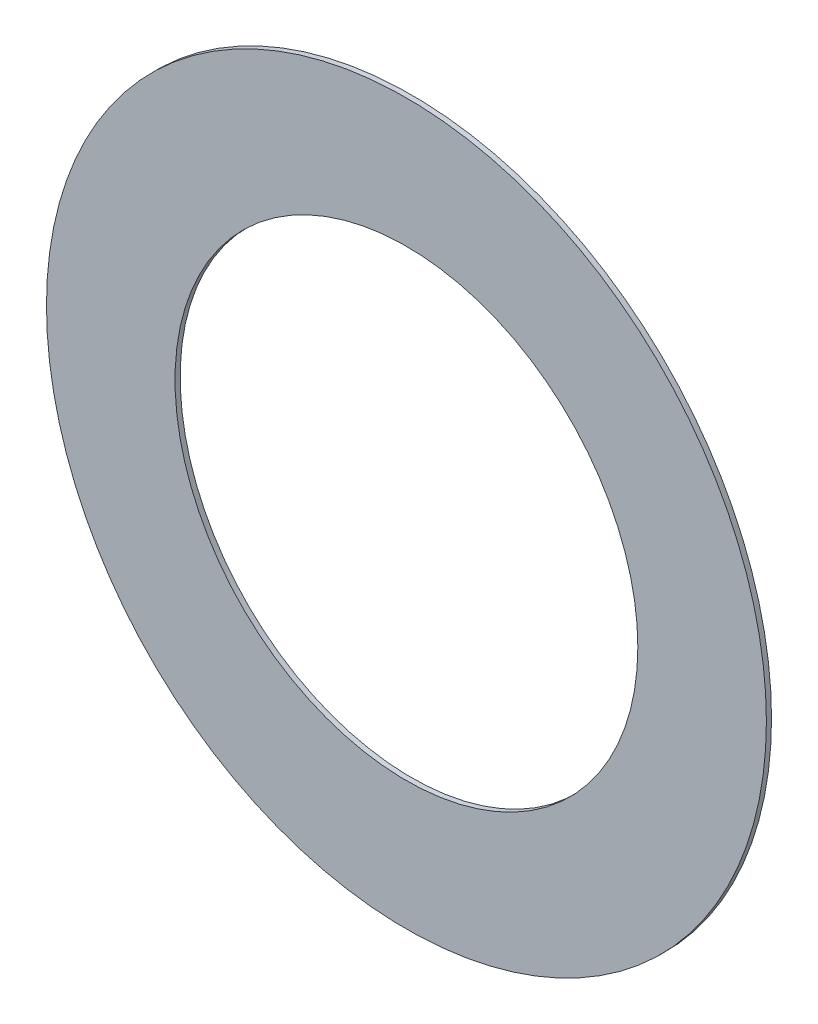
ISO-10303-21;
HEADER;
FILE_DESCRIPTION(('STEP AP214'),'2;1');
FILE_NAME('part.step','',(''),(''),'','','');
FILE_SCHEMA(('AUTOMOTIVE_DESIGN { 1 0 10303 214 1 1 1 1 }'));
ENDSEC;
DATA;
#1=APPLICATION_CONTEXT('core data for automotive mechanical design processes');
#2=APPLICATION_PROTOCOL_DEFINITION('international standard','automotive_design',2000,#1);
#3=PRODUCT_CONTEXT('',#1,'mechanical');
#4=PRODUCT('Part','Part','',(#3));
#5=PRODUCT_RELATED_PRODUCT_CATEGORY('part','',(#4));
#6=PRODUCT_DEFINITION_FORMATION('','',#4);
#7=PRODUCT_DEFINITION_CONTEXT('part definition',#1,'design');
#8=PRODUCT_DEFINITION('design','',#6,#7);
#9=PRODUCT_DEFINITION_SHAPE('','',#8);
#10=(LENGTH_UNIT() NAMED_UNIT(*) SI_UNIT(.MILLI.,.METRE.));
#11=(NAMED_UNIT(*) PLANE_ANGLE_UNIT() SI_UNIT($,.RADIAN.));
#12=(NAMED_UNIT(*) SI_UNIT($,.STERADIAN.) SOLID_ANGLE_UNIT());
#13=UNCERTAINTY_MEASURE_WITH_UNIT(LENGTH_MEASURE(1.E-05),#10,'distance_accuracy_value','');
#14=(GEOMETRIC_REPRESENTATION_CONTEXT(3) GLOBAL_UNCERTAINTY_ASSIGNED_CONTEXT((#13)) GLOBAL_UNIT_ASSIGNED_CONTEXT((#10,
#11,#12)) REPRESENTATION_CONTEXT('',''));
#15=CARTESIAN_POINT('',(0.,0.,0.));
#16=DIRECTION('',(0.,0.,1.));
#17=DIRECTION('',(1.,0.,0.));
#18=AXIS2_PLACEMENT_3D('',#15,#16,#17);
#19=CARTESIAN_POINT('',(0.,0.,0.01));
#20=DIRECTION('',(0.,0.,1.));
#21=DIRECTION('',(1.,0.,0.));
#22=AXIS2_PLACEMENT_3D('',#19,#20,#21);
#23=PLANE('',#22);
#24=CARTESIAN_POINT('',(-4.445,-8.965,0.01));
#25=DIRECTION('',(0.,0.,1.));
#26=DIRECTION('',(1.,0.,0.));
#27=AXIS2_PLACEMENT_3D('',#24,#25,#26);
#28=CIRCLE('',#27,0.45);
#29=CARTESIAN_POINT('',(-3.995,-8.965,0.01));
#30=VERTEX_POINT('',#29);
#31=EDGE_CURVE('E27',#30,#30,#28,.F.);
#32=ORIENTED_EDGE('',*,*,#31,.T.);
#33=EDGE_LOOP('',(#32));
#34=FACE_BOUND('',#33,.T.);
#35=CARTESIAN_POINT('',(-4.445,-8.965,0.01));
#36=DIRECTION('',(0.,0.,1.));
#37=DIRECTION('',(1.,0.,0.));
#38=AXIS2_PLACEMENT_3D('',#35,#36,#37);
#39=CIRCLE('',#38,0.7);
#40=CARTESIAN_POINT('',(-3.745,-8.965,0.01));
#41=VERTEX_POINT('',#40);
#42=EDGE_CURVE('E18',#41,#41,#39,.F.);
#43=ORIENTED_EDGE('',*,*,#42,.F.);
#44=EDGE_LOOP('',(#43));
#45=FACE_BOUND('',#44,.T.);
#46=ADVANCED_FACE('F15',(#34,#45),#23,.T.);
#47=CARTESIAN_POINT('',(-4.445,-8.965,0.));
#48=DIRECTION('',(0.,0.,1.));
#49=DIRECTION('',(1.,0.,0.));
#50=AXIS2_PLACEMENT_3D('',#47,#48,#49);
#51=CYLINDRICAL_SURFACE('',#50,0.7);
#52=ORIENTED_EDGE('',*,*,#42,.T.);
#53=EDGE_LOOP('',(#52));
#54=FACE_BOUND('',#53,.T.);
#55=CARTESIAN_POINT('',(-4.445,-8.965,0.));
#56=DIRECTION('',(0.,0.,1.));
#57=DIRECTION('',(1.,0.,0.));
#58=AXIS2_PLACEMENT_3D('',#55,#56,#57);
#59=CIRCLE('',#58,0.7);
#60=CARTESIAN_POINT('',(-3.745,-8.965,0.));
#61=VERTEX_POINT('',#60);
#62=EDGE_CURVE('E22',#61,#61,#59,.T.);
#63=ORIENTED_EDGE('',*,*,#62,.T.);
#64=EDGE_LOOP('',(#63));
#65=FACE_BOUND('',#64,.T.);
#66=ADVANCED_FACE('F35',(#54,#65),#51,.T.);
#67=CARTESIAN_POINT('',(-4.445,-8.965,0.));
#68=DIRECTION('',(0.,0.,1.));
#69=DIRECTION('',(1.,0.,0.));
#70=AXIS2_PLACEMENT_3D('',#67,#68,#69);
#71=CYLINDRICAL_SURFACE('',#70,0.45);
#72=ORIENTED_EDGE('',*,*,#31,.F.);
#73=EDGE_LOOP('',(#72));
#74=FACE_BOUND('',#73,.T.);
#75=CARTESIAN_POINT('',(-4.445,-8.965,0.));
#76=DIRECTION('',(0.,0.,1.));
#77=DIRECTION('',(1.,0.,0.));
#78=AXIS2_PLACEMENT_3D('',#75,#76,#77);
#79=CIRCLE('',#78,0.45);
#80=CARTESIAN_POINT('',(-3.995,-8.965,0.));
#81=VERTEX_POINT('',#80);
#82=EDGE_CURVE('E10',#81,#81,#79,.F.);
#83=ORIENTED_EDGE('',*,*,#82,.T.);
#84=EDGE_LOOP('',(#83));
#85=FACE_BOUND('',#84,.T.);
#86=ADVANCED_FACE('F43',(#74,#85),#71,.F.);
#87=CARTESIAN_POINT('',(0.,0.,0.));
#88=DIRECTION('',(0.,0.,1.));
#89=DIRECTION('',(1.,0.,0.));
#90=AXIS2_PLACEMENT_3D('',#87,#88,#89);
#91=PLANE('',#90);
#92=ORIENTED_EDGE('',*,*,#82,.F.);
#93=EDGE_LOOP('',(#92));
#94=FACE_BOUND('',#93,.T.);
#95=ORIENTED_EDGE('',*,*,#62,.F.);
#96=EDGE_LOOP('',(#95));
#97=FACE_BOUND('',#96,.T.);
#98=ADVANCED_FACE('F44',(#94,#97),#91,.F.);
#99=CLOSED_SHELL('',(#46,#66,#86,#98));
#100=MANIFOLD_SOLID_BREP('B1',#99);
#101=ADVANCED_BREP_SHAPE_REPRESENTATION('',(#18,#100),#14);
#102=SHAPE_DEFINITION_REPRESENTATION(#9,#101);
ENDSEC;
END-ISO-10303-21;
